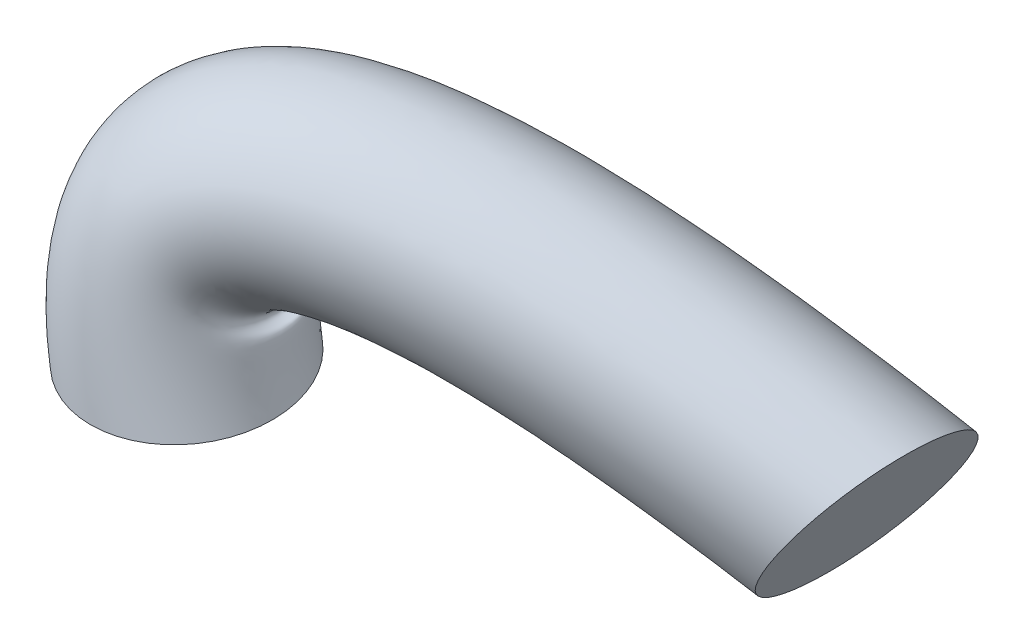
ISO-10303-21;
HEADER;
FILE_DESCRIPTION(('STEP AP214'),'2;1');
FILE_NAME('part.step','',(''),(''),'','','');
FILE_SCHEMA(('AUTOMOTIVE_DESIGN { 1 0 10303 214 1 1 1 1 }'));
ENDSEC;
DATA;
#1=APPLICATION_CONTEXT('core data for automotive mechanical design processes');
#2=APPLICATION_PROTOCOL_DEFINITION('international standard','automotive_design',2000,#1);
#3=PRODUCT_CONTEXT('',#1,'mechanical');
#4=PRODUCT('Part','Part','',(#3));
#5=PRODUCT_RELATED_PRODUCT_CATEGORY('part','',(#4));
#6=PRODUCT_DEFINITION_FORMATION('','',#4);
#7=PRODUCT_DEFINITION_CONTEXT('part definition',#1,'design');
#8=PRODUCT_DEFINITION('design','',#6,#7);
#9=PRODUCT_DEFINITION_SHAPE('','',#8);
#10=(LENGTH_UNIT() NAMED_UNIT(*) SI_UNIT(.MILLI.,.METRE.));
#11=(NAMED_UNIT(*) PLANE_ANGLE_UNIT() SI_UNIT($,.RADIAN.));
#12=(NAMED_UNIT(*) SI_UNIT($,.STERADIAN.) SOLID_ANGLE_UNIT());
#13=UNCERTAINTY_MEASURE_WITH_UNIT(LENGTH_MEASURE(1.E-05),#10,'distance_accuracy_value','');
#14=(GEOMETRIC_REPRESENTATION_CONTEXT(3) GLOBAL_UNCERTAINTY_ASSIGNED_CONTEXT((#13)) GLOBAL_UNIT_ASSIGNED_CONTEXT((#10,
#11,#12)) REPRESENTATION_CONTEXT('',''));
#15=CARTESIAN_POINT('',(0.,0.,0.));
#16=DIRECTION('',(0.,0.,1.));
#17=DIRECTION('',(1.,0.,0.));
#18=AXIS2_PLACEMENT_3D('',#15,#16,#17);
#19=CARTESIAN_POINT('',(-180.892438936026,511.560903975284,397.69758628671));
#20=DIRECTION('',(0.,0.994032679339711,0.109082686090487));
#21=DIRECTION('',(0.,-0.109082686090487,0.994032679339711));
#22=AXIS2_PLACEMENT_3D('',#19,#20,#21);
#23=PLANE('',#22);
#24=CARTESIAN_POINT('',(-180.892438936026,511.560903975284,397.69758628671));
#25=DIRECTION('',(0.,0.994032679339711,0.109082686090487));
#26=DIRECTION('',(0.,-0.109082686090487,0.994032679339711));
#27=AXIS2_PLACEMENT_3D('',#24,#25,#26);
#28=CIRCLE('',#27,31.75);
#29=CARTESIAN_POINT('',(-180.892438936026,508.097528691911,429.258123855746));
#30=VERTEX_POINT('',#29);
#31=EDGE_CURVE('E40',#30,#30,#28,.T.);
#32=ORIENTED_EDGE('',*,*,#31,.F.);
#33=EDGE_LOOP('',(#32));
#34=FACE_BOUND('',#33,.T.);
#35=ADVANCED_FACE('F33',(#34),#23,.F.);
#36=CARTESIAN_POINT('',(-15.6074389360235,520.715978156015,339.752092259279));
#37=DIRECTION('',(0.849490226044737,-0.526704787908429,0.030796464875044));
#38=DIRECTION('',(0.289320304010376,0.513848886861982,0.807621868920132));
#39=AXIS2_PLACEMENT_3D('',#36,#37,#38);
#40=PLANE('',#39);
#41=CARTESIAN_POINT('',(-15.6074389360235,520.715978156015,339.752092259279));
#42=DIRECTION('',(0.849490226044737,-0.526704787908429,0.030796464875044));
#43=DIRECTION('',(0.289320304010376,0.513848886861982,0.807621868920132));
#44=AXIS2_PLACEMENT_3D('',#41,#42,#43);
#45=CIRCLE('',#44,31.75);
#46=CARTESIAN_POINT('',(-6.42151928369401,537.030680313883,365.394086597493));
#47=VERTEX_POINT('',#46);
#48=EDGE_CURVE('E11',#47,#47,#45,.T.);
#49=ORIENTED_EDGE('',*,*,#48,.T.);
#50=EDGE_LOOP('',(#49));
#51=FACE_BOUND('',#50,.T.);
#52=ADVANCED_FACE('F47',(#51),#40,.T.);
#53=CARTESIAN_POINT('',(-180.892438936026,508.097528691911,429.258123855746));
#54=CARTESIAN_POINT('',(-182.166530935944,512.763292099232,429.041596092701));
#55=CARTESIAN_POINT('',(-183.181430108507,517.23065368848,428.763991868873));
#56=CARTESIAN_POINT('',(-184.676031600783,525.829435660423,428.072345054372));
#57=CARTESIAN_POINT('',(-185.156939325926,529.961789704067,427.658584971981));
#58=CARTESIAN_POINT('',(-185.52422522625,537.962122632186,426.664264877963));
#59=CARTESIAN_POINT('',(-185.411077125502,541.833714748399,426.083361333465));
#60=CARTESIAN_POINT('',(-184.692808191902,547.458201620203,425.049561805907));
#61=CARTESIAN_POINT('',(-184.361215002877,549.301724380378,424.677747458662));
#62=CARTESIAN_POINT('',(-183.492405255422,552.911956820982,423.874381890556));
#63=CARTESIAN_POINT('',(-182.954921255074,554.678647298004,423.442741673443));
#64=CARTESIAN_POINT('',(-181.657344007078,558.106998533524,422.517852200586));
#65=CARTESIAN_POINT('',(-180.897021501054,559.768388858214,422.024562216608));
#66=CARTESIAN_POINT('',(-179.149539806747,562.947751487526,420.980299209503));
#67=CARTESIAN_POINT('',(-178.162386160262,564.465310078295,420.429386015574));
#68=CARTESIAN_POINT('',(-175.973810717107,567.319374532261,419.279455117145));
#69=CARTESIAN_POINT('',(-174.772649867759,568.655597105736,418.680566539042));
#70=CARTESIAN_POINT('',(-172.181243563343,571.121630466475,417.446869243752));
#71=CARTESIAN_POINT('',(-170.791314607246,572.25144000795,416.812169204693));
#72=CARTESIAN_POINT('',(-166.38029761375,575.3185282815,414.870504962867));
#73=CARTESIAN_POINT('',(-163.122604062256,576.930485507444,413.527979491072));
#74=CARTESIAN_POINT('',(-156.125232331602,579.357233567494,410.789314927413));
#75=CARTESIAN_POINT('',(-152.384020383585,580.176360248063,409.392042902347));
#76=CARTESIAN_POINT('',(-144.457831114374,581.131512974813,406.541015805077));
#77=CARTESIAN_POINT('',(-140.270946929787,581.268155495122,405.08652069409));
#78=CARTESIAN_POINT('',(-131.439950440454,580.933131740607,402.105959467203));
#79=CARTESIAN_POINT('',(-126.795070229812,580.461067703296,400.579685791926));
#80=CARTESIAN_POINT('',(-112.140588580384,578.194465816304,395.873163722725));
#81=CARTESIAN_POINT('',(-101.408165352943,575.553477183969,392.563638062911));
#82=CARTESIAN_POINT('',(-77.8810873292259,568.15107327617,385.534514941067));
#83=CARTESIAN_POINT('',(-65.0872522470407,563.385751360492,381.815745516398));
#84=CARTESIAN_POINT('',(-37.3644330667755,551.769992217711,373.938192645559));
#85=CARTESIAN_POINT('',(-22.4362434616655,544.91847691152,369.779832521705));
#86=CARTESIAN_POINT('',(-6.42151928369405,537.030680313883,365.394086597493));
#87=CARTESIAN_POINT('',(-117.392438936026,508.097528691911,429.258123855746));
#88=CARTESIAN_POINT('',(-118.666530935605,510.747880505907,429.323800998297));
#89=CARTESIAN_POINT('',(-119.772844199085,512.921716841242,429.398683008627));
#90=CARTESIAN_POINT('',(-121.870287675978,516.209418530627,429.657380384884));
#91=CARTESIAN_POINT('',(-122.86058625273,517.317111373417,429.841774944371));
#92=CARTESIAN_POINT('',(-125.099023783852,518.469316391636,430.447828018599));
#93=CARTESIAN_POINT('',(-126.356009105984,518.502921633189,430.874046502742));
#94=CARTESIAN_POINT('',(-128.773817116014,518.033680653603,431.768632457556));
#95=CARTESIAN_POINT('',(-129.668296932746,517.795117726042,432.108685493603));
#96=CARTESIAN_POINT('',(-131.655482393757,517.256709138338,432.865329041681));
#97=CARTESIAN_POINT('',(-132.74890363908,516.95774194579,433.282041872626));
#98=CARTESIAN_POINT('',(-135.103135098466,516.424849505366,434.163744995053));
#99=CARTESIAN_POINT('',(-136.363841088177,516.192340816627,434.628501204224));
#100=CARTESIAN_POINT('',(-138.956335959648,515.905749668898,435.557398645073));
#101=CARTESIAN_POINT('',(-140.286939844399,515.852730890982,436.02098469131));
#102=CARTESIAN_POINT('',(-142.876704611879,515.984515961391,436.890363702302));
#103=CARTESIAN_POINT('',(-144.134313821797,516.169251738131,437.29563424926));
#104=CARTESIAN_POINT('',(-146.433937224602,516.764801385557,438.0006080845));
#105=CARTESIAN_POINT('',(-147.475036814783,517.174638278694,438.30013462581));
#106=CARTESIAN_POINT('',(-150.116947702308,518.645196948698,438.999930836222));
#107=CARTESIAN_POINT('',(-151.214634642401,519.940432171238,439.194880307774));
#108=CARTESIAN_POINT('',(-151.83834602881,522.511101793793,439.048749121964));
#109=CARTESIAN_POINT('',(-151.38103758874,523.779958829393,438.714303325544));
#110=CARTESIAN_POINT('',(-149.107059253427,525.881499887637,437.64046524579));
#111=CARTESIAN_POINT('',(-147.2976204948,526.718479120068,436.902950535051));
#112=CARTESIAN_POINT('',(-142.569477844356,527.802562733303,435.13023536555));
#113=CARTESIAN_POINT('',(-139.651860487303,528.053084578739,434.094928871975));
#114=CARTESIAN_POINT('',(-129.508327282774,527.863018461846,430.644101848404));
#115=CARTESIAN_POINT('',(-120.911497888677,526.479687546551,427.890606183088));
#116=CARTESIAN_POINT('',(-100.836331477529,521.258914336572,421.739399723491));
#117=CARTESIAN_POINT('',(-89.3445956673569,517.429139587939,418.336021871617));
#118=CARTESIAN_POINT('',(-63.7892989370727,507.449059884744,410.97251296314));
#119=CARTESIAN_POINT('',(-49.7204045790935,501.299110831228,407.010503640609));
#120=CARTESIAN_POINT('',(-34.4379119665137,494.031220884504,402.788982369821));
#121=CARTESIAN_POINT('',(-117.392438936026,515.024279258657,366.137048717674));
#122=CARTESIAN_POINT('',(-118.166163526916,516.98782378236,366.127357327203));
#123=CARTESIAN_POINT('',(-118.732076810706,518.355202836138,366.129900508726));
#124=CARTESIAN_POINT('',(-119.702277586303,519.668965107487,366.278550515764));
#125=CARTESIAN_POINT('',(-120.103322629858,519.607308495331,366.424671521504));
#126=CARTESIAN_POINT('',(-121.23547574646,517.91665765877,367.049530904678));
#127=CARTESIAN_POINT('',(-121.974482738143,516.269530036968,367.533516317988));
#128=CARTESIAN_POINT('',(-123.874789481726,512.870311920743,368.660956257453));
#129=CARTESIAN_POINT('',(-124.641504742364,511.588588933803,369.103275492729));
#130=CARTESIAN_POINT('',(-126.505198717871,508.85925957159,370.124363576292));
#131=CARTESIAN_POINT('',(-127.603427917601,507.41257007009,370.703432735934));
#132=CARTESIAN_POINT('',(-130.13328466829,504.53606563425,371.973504983052));
#133=CARTESIAN_POINT('',(-131.565266511326,503.108208125106,372.664355444312));
#134=CARTESIAN_POINT('',(-134.674777342654,500.459528563584,374.101245858072));
#135=CARTESIAN_POINT('',(-136.351110249649,499.240597618066,374.846610966334));
#136=CARTESIAN_POINT('',(-139.781660249538,497.144436992133,376.316195511839));
#137=CARTESIAN_POINT('',(-141.533803775514,496.267705820887,377.039634279252));
#138=CARTESIAN_POINT('',(-144.921455909005,494.894918327504,378.393223222363));
#139=CARTESIAN_POINT('',(-146.555416916378,494.397887520307,379.022979295445));
#140=CARTESIAN_POINT('',(-151.039558637316,493.405183568474,380.699249935904));
#141=CARTESIAN_POINT('',(-153.441012353373,493.407326656822,381.522224427224));
#142=CARTESIAN_POINT('',(-156.519390099192,493.953237533367,382.501124081821));
#143=CARTESIAN_POINT('',(-157.216048779767,494.48175626333,382.665949971107));
#144=CARTESIAN_POINT('',(-157.02069898198,495.435914716379,382.465374917298));
#145=CARTESIAN_POINT('',(-156.139735368131,495.864616700938,382.103331623347));
#146=CARTESIAN_POINT('',(-153.066162799614,496.315856146374,380.986454857233));
#147=CARTESIAN_POINT('',(-150.876176189804,496.342606595903,380.231930469431));
#148=CARTESIAN_POINT('',(-142.679962592432,495.632684950625,377.52148218265));
#149=CARTESIAN_POINT('',(-135.073210960073,494.096810571009,375.128768024168));
#150=CARTESIAN_POINT('',(-116.63531741444,488.680174669541,369.566282418958));
#151=CARTESIAN_POINT('',(-105.789137281173,484.814893974652,366.389187836954));
#152=CARTESIAN_POINT('',(-81.3279041397077,474.802403945372,359.405287754694));
#153=CARTESIAN_POINT('',(-67.7059287106637,468.657706681082,355.595757334602));
#154=CARTESIAN_POINT('',(-52.8097512711726,461.401816568768,351.504993693393));
#155=CARTESIAN_POINT('',(-180.892438936026,515.024279258657,366.137048717674));
#156=CARTESIAN_POINT('',(-181.666163527348,519.003235375685,365.845152421853));
#157=CARTESIAN_POINT('',(-182.140662720141,522.664139683376,365.495209368972));
#158=CARTESIAN_POINT('',(-182.508021511095,529.288982237283,364.693515185251));
#159=CARTESIAN_POINT('',(-182.39967570302,532.251986825889,364.241481549114));
#160=CARTESIAN_POINT('',(-181.660677188893,537.409463899412,363.265967764042));
#161=CARTESIAN_POINT('',(-181.029550757661,539.600323152098,362.74283114871));
#162=CARTESIAN_POINT('',(-179.793780557615,542.294832887384,361.941885605804));
#163=CARTESIAN_POINT('',(-179.334422812495,543.095195588139,361.672337457807));
#164=CARTESIAN_POINT('',(-178.342121579537,544.514507254234,361.133416425148));
#165=CARTESIAN_POINT('',(-177.809445533596,545.133475422341,360.864132536751));
#166=CARTESIAN_POINT('',(-176.687493576902,546.218214662371,360.327612188585));
#167=CARTESIAN_POINT('',(-176.098446924229,546.684256166656,360.060416456696));
#168=CARTESIAN_POINT('',(-174.867981189726,547.501530382248,359.524146422501));
#169=CARTESIAN_POINT('',(-174.22655656553,547.853176805379,359.25501229058));
#170=CARTESIAN_POINT('',(-172.878766354748,548.479295563003,358.705286926701));
#171=CARTESIAN_POINT('',(-172.172139821476,548.754051188529,358.424566569034));
#172=CARTESIAN_POINT('',(-170.668762247746,549.251747408384,357.839484381616));
#173=CARTESIAN_POINT('',(-169.871694708802,549.474689249524,357.535013874347));
#174=CARTESIAN_POINT('',(-167.302908548836,550.078514901355,356.56982406251));
#175=CARTESIAN_POINT('',(-165.348981773141,550.39737999294,355.855323610479));
#176=CARTESIAN_POINT('',(-160.806276402072,550.799369307155,354.241689887314));
#177=CARTESIAN_POINT('',(-158.219031574511,550.87815768205,353.34368954791));
#178=CARTESIAN_POINT('',(-152.371470843028,550.685927803505,351.365925476585));
#179=CARTESIAN_POINT('',(-149.113061803001,550.414293075991,350.286901782385));
#180=CARTESIAN_POINT('',(-141.936635395828,549.446425153678,347.962178958885));
#181=CARTESIAN_POINT('',(-138.019385932314,548.750589720528,346.716687389381));
#182=CARTESIAN_POINT('',(-125.312223890041,545.964132304948,342.750544056971));
#183=CARTESIAN_POINT('',(-115.56987842434,543.170600208599,339.801799903991));
#184=CARTESIAN_POINT('',(-93.6800732661375,535.572333608966,333.361397636534));
#185=CARTESIAN_POINT('',(-81.5317938604327,530.771505746781,329.868911481311));
#186=CARTESIAN_POINT('',(-54.9030382698343,519.123336278764,322.370967437538));
#187=CARTESIAN_POINT('',(-40.4217675912155,512.277072760617,318.365086215951));
#188=CARTESIAN_POINT('',(-24.793358588353,504.401275998147,314.110097921065));
#189=CARTESIAN_POINT('',(-244.392438936026,515.024279258657,366.137048717674));
#190=CARTESIAN_POINT('',(-245.16616352778,521.018646969009,365.562947516504));
#191=CARTESIAN_POINT('',(-245.549248629575,526.973076530613,364.860518229219));
#192=CARTESIAN_POINT('',(-245.313765435886,538.908999367079,363.108479854738));
#193=CARTESIAN_POINT('',(-244.696028776182,544.896665156446,362.058291576723));
#194=CARTESIAN_POINT('',(-242.085878631326,556.902270140055,359.482404623405));
#195=CARTESIAN_POINT('',(-240.084618777179,562.931116267227,357.952145979432));
#196=CARTESIAN_POINT('',(-235.712771633503,571.719353854025,355.222814954155));
#197=CARTESIAN_POINT('',(-234.027340882627,574.601802242474,354.241399422885));
#198=CARTESIAN_POINT('',(-230.179044441203,580.169754936878,352.142469274004));
#199=CARTESIAN_POINT('',(-228.015463149591,582.854380774593,351.024832337567));
#200=CARTESIAN_POINT('',(-223.241702485514,587.900363690493,348.681719394119));
#201=CARTESIAN_POINT('',(-220.631627337133,590.260304208206,347.45647746908));
#202=CARTESIAN_POINT('',(-215.061185036797,594.543532200912,344.947046986931));
#203=CARTESIAN_POINT('',(-212.102002881412,596.465755992692,343.663413614827));
#204=CARTESIAN_POINT('',(-205.975872459957,599.814154133873,341.094378341562));
#205=CARTESIAN_POINT('',(-202.810475867438,601.240396556171,339.809498858816));
#206=CARTESIAN_POINT('',(-196.416068586487,603.608576489264,337.285745540868));
#207=CARTESIAN_POINT('',(-193.187972501226,604.551490978741,336.04704845325));
#208=CARTESIAN_POINT('',(-183.566258460355,606.751846234235,332.440398189117));
#209=CARTESIAN_POINT('',(-177.256951192908,607.387433329058,330.188422793733));
#210=CARTESIAN_POINT('',(-165.093162704951,607.645501080943,325.982255692806));
#211=CARTESIAN_POINT('',(-159.222014369254,607.274559100771,324.021429124713));
#212=CARTESIAN_POINT('',(-147.722242704077,605.935940890631,320.266476035872));
#213=CARTESIAN_POINT('',(-142.086388237871,604.963969451044,318.470471941423));
#214=CARTESIAN_POINT('',(-130.807107992043,602.576994160982,314.937903060537));
#215=CARTESIAN_POINT('',(-125.162595674824,601.158572845153,313.201444309332));
#216=CARTESIAN_POINT('',(-107.944485187651,596.295579659272,307.979605931293));
#217=CARTESIAN_POINT('',(-96.0665458886062,592.244389846189,304.474831783814));
#218=CARTESIAN_POINT('',(-70.7248291178347,582.464492548392,297.156512854111));
#219=CARTESIAN_POINT('',(-57.2744504396927,576.728117518911,293.348635125668));
#220=CARTESIAN_POINT('',(-28.478172399961,563.444268612155,285.336647120381));
#221=CARTESIAN_POINT('',(-13.1376064717673,555.896438840152,281.134415097299));
#222=CARTESIAN_POINT('',(3.22303409446667,547.400735427526,276.715202148737));
#223=CARTESIAN_POINT('',(-244.392438936026,508.097528691911,429.258123855746));
#224=CARTESIAN_POINT('',(-245.666530936284,514.778703692557,428.759391187104));
#225=CARTESIAN_POINT('',(-246.590016017928,521.539590535717,428.12930072912));
#226=CARTESIAN_POINT('',(-247.481775525588,535.449452790218,426.487309723859));
#227=CARTESIAN_POINT('',(-247.453292399123,542.606468034716,425.47539499959));
#228=CARTESIAN_POINT('',(-245.949426668648,557.454928872736,422.880701737326));
#229=CARTESIAN_POINT('',(-244.466145145021,565.16450786361,421.292676164187));
#230=CARTESIAN_POINT('',(-240.611799267791,576.882722586804,418.330491154258));
#231=CARTESIAN_POINT('',(-239.054133073008,580.808331034714,417.24680942372));
#232=CARTESIAN_POINT('',(-235.329328117088,588.567204503627,414.883434739432));
#233=CARTESIAN_POINT('',(-233.160938871069,592.399552650219,413.603441474259));
#234=CARTESIAN_POINT('',(-228.21155291569,599.789147561683,410.871959406119));
#235=CARTESIAN_POINT('',(-225.43020191393,603.3444368998,409.420623228992));
#236=CARTESIAN_POINT('',(-219.342743653846,609.989753306154,406.403199773932));
#237=CARTESIAN_POINT('',(-216.037832476125,613.077889265608,404.83778733984));
#238=CARTESIAN_POINT('',(-209.070916822335,618.654233103131,401.668546531989));
#239=CARTESIAN_POINT('',(-205.410985913721,621.141942473341,400.065498828824));
#240=CARTESIAN_POINT('',(-197.928549902084,625.478459547393,396.893130403004));
#241=CARTESIAN_POINT('',(-194.107592399709,627.328241737206,395.324203783576));
#242=CARTESIAN_POINT('',(-182.643647525191,631.991859614303,390.741079089512));
#243=CARTESIAN_POINT('',(-175.030573482111,633.92053884365,387.861078674371));
#244=CARTESIAN_POINT('',(-160.412118634394,636.203365341194,382.529880732862));
#245=CARTESIAN_POINT('',(-153.38700317843,636.572761666733,380.069782479149));
#246=CARTESIAN_POINT('',(-139.808602975321,636.38152606199,375.441566364364));
#247=CARTESIAN_POINT('',(-133.244273364774,635.817831870175,373.270090853128));
#248=CARTESIAN_POINT('',(-120.310423036551,634.063700747911,369.081683568855));
#249=CARTESIAN_POINT('',(-113.938279972322,632.869050827853,367.064442711876));
#250=CARTESIAN_POINT('',(-94.7728498779931,628.525913170762,361.102225597046));
#251=CARTESIAN_POINT('',(-81.9048328172093,624.627266821387,357.236669942734));
#252=CARTESIAN_POINT('',(-54.9258431809231,615.043232215769,349.329630158644));
#253=CARTESIAN_POINT('',(-40.8299088267245,609.342363133046,345.295469161179));
#254=CARTESIAN_POINT('',(-10.9395671964783,596.090924550678,336.903872327979));
#255=CARTESIAN_POINT('',(4.84791765576246,588.537842991813,332.549161402801));
#256=CARTESIAN_POINT('',(21.5948733991256,580.030139743262,327.999190825166));
#257=CARTESIAN_POINT('',(-180.892438936026,508.097528691911,429.258123855746));
#258=CARTESIAN_POINT('',(-182.166530935944,512.763292099232,429.041596092701));
#259=CARTESIAN_POINT('',(-183.181430108507,517.23065368848,428.763991868873));
#260=CARTESIAN_POINT('',(-184.676031600783,525.829435660423,428.072345054372));
#261=CARTESIAN_POINT('',(-185.156939325926,529.961789704067,427.658584971981));
#262=CARTESIAN_POINT('',(-185.52422522625,537.962122632186,426.664264877963));
#263=CARTESIAN_POINT('',(-185.411077125502,541.833714748399,426.083361333465));
#264=CARTESIAN_POINT('',(-184.692808191902,547.458201620203,425.049561805907));
#265=CARTESIAN_POINT('',(-184.361215002877,549.301724380378,424.677747458662));
#266=CARTESIAN_POINT('',(-183.492405255422,552.911956820982,423.874381890556));
#267=CARTESIAN_POINT('',(-182.954921255074,554.678647298004,423.442741673443));
#268=CARTESIAN_POINT('',(-181.657344007078,558.106998533524,422.517852200586));
#269=CARTESIAN_POINT('',(-180.897021501054,559.768388858214,422.024562216608));
#270=CARTESIAN_POINT('',(-179.149539806747,562.947751487526,420.980299209503));
#271=CARTESIAN_POINT('',(-178.162386160262,564.465310078295,420.429386015574));
#272=CARTESIAN_POINT('',(-175.973810717107,567.319374532261,419.279455117145));
#273=CARTESIAN_POINT('',(-174.772649867759,568.655597105736,418.680566539042));
#274=CARTESIAN_POINT('',(-172.181243563343,571.121630466475,417.446869243752));
#275=CARTESIAN_POINT('',(-170.791314607246,572.25144000795,416.812169204693));
#276=CARTESIAN_POINT('',(-166.38029761375,575.3185282815,414.870504962867));
#277=CARTESIAN_POINT('',(-163.122604062256,576.930485507444,413.527979491072));
#278=CARTESIAN_POINT('',(-156.125232331602,579.357233567494,410.789314927413));
#279=CARTESIAN_POINT('',(-152.384020383585,580.176360248063,409.392042902347));
#280=CARTESIAN_POINT('',(-144.457831114374,581.131512974813,406.541015805077));
#281=CARTESIAN_POINT('',(-140.270946929787,581.268155495122,405.08652069409));
#282=CARTESIAN_POINT('',(-131.439950440454,580.933131740607,402.105959467203));
#283=CARTESIAN_POINT('',(-126.795070229812,580.461067703296,400.579685791926));
#284=CARTESIAN_POINT('',(-112.140588580384,578.194465816304,395.873163722725));
#285=CARTESIAN_POINT('',(-101.408165352943,575.553477183969,392.563638062911));
#286=CARTESIAN_POINT('',(-77.8810873292259,568.15107327617,385.534514941067));
#287=CARTESIAN_POINT('',(-65.0872522470407,563.385751360492,381.815745516398));
#288=CARTESIAN_POINT('',(-37.3644330667755,551.769992217711,373.938192645559));
#289=CARTESIAN_POINT('',(-22.4362434616655,544.91847691152,369.779832521705));
#290=CARTESIAN_POINT('',(-6.42151928369405,537.030680313883,365.394086597493));
#291=(BOUNDED_SURFACE() B_SPLINE_SURFACE(3,3,((#53,#54,#55,#56,#57,#58,#59,#60,#61,#62,#63,#64,
#65,#66,#67,#68,#69,#70,#71,#72,#73,#74,#75,#76,#77,#78,#79,#80,#81,#82,#83,#84,#85,#86),(#87,
#88,#89,#90,#91,#92,#93,#94,#95,#96,#97,#98,#99,#100,#101,#102,#103,#104,#105,#106,#107,#108,
#109,#110,#111,#112,#113,#114,#115,#116,#117,#118,#119,#120),(#121,#122,#123,#124,#125,#126,
#127,#128,#129,#130,#131,#132,#133,#134,#135,#136,#137,#138,#139,#140,#141,#142,#143,#144,#145,
#146,#147,#148,#149,#150,#151,#152,#153,#154),(#155,#156,#157,#158,#159,#160,#161,#162,#163,
#164,#165,#166,#167,#168,#169,#170,#171,#172,#173,#174,#175,#176,#177,#178,#179,#180,#181,#182,
#183,#184,#185,#186,#187,#188),(#189,#190,#191,#192,#193,#194,#195,#196,#197,#198,#199,#200,
#201,#202,#203,#204,#205,#206,#207,#208,#209,#210,#211,#212,#213,#214,#215,#216,#217,#218,#219,
#220,#221,#222),(#223,#224,#225,#226,#227,#228,#229,#230,#231,#232,#233,#234,#235,#236,#237,
#238,#239,#240,#241,#242,#243,#244,#245,#246,#247,#248,#249,#250,#251,#252,#253,#254,#255,#256),
(#257,#258,#259,#260,#261,#262,#263,#264,#265,#266,#267,#268,#269,#270,#271,#272,#273,#274,#275,
#276,#277,#278,#279,#280,#281,#282,#283,#284,#285,#286,#287,#288,#289,#290)),.UNSPECIFIED.,.T.,
.F.,.F.) B_SPLINE_SURFACE_WITH_KNOTS((4,3,4),(4,2,2,2,2,2,2,2,2,2,2,2,2,2,2,2,4),(0.,0.5,1.),
(0.,0.0625,0.125,0.1875,0.21875,0.25,0.28125,0.3125,0.34375,0.375,0.4375,0.5,0.5625,0.625,0.75,
0.875,1.),.UNSPECIFIED.) GEOMETRIC_REPRESENTATION_ITEM() RATIONAL_B_SPLINE_SURFACE(((1.,1.,1.,
1.,1.,1.,1.,1.,1.,1.,1.,1.,1.,1.,1.,1.,1.,1.,1.,1.,1.,1.,1.,1.,1.,1.,1.,1.,1.,1.,1.,1.,1.,1.),
(0.333333333333333,0.333333333333333,0.333333333333333,0.333333333333333,0.333333333333333,
0.333333333333333,0.333333333333333,0.333333333333333,0.333333333333333,0.333333333333333,
0.333333333333333,0.333333333333333,0.333333333333333,0.333333333333333,0.333333333333333,
0.333333333333333,0.333333333333333,0.333333333333333,0.333333333333333,0.333333333333333,
0.333333333333333,0.333333333333333,0.333333333333333,0.333333333333333,0.333333333333333,
0.333333333333333,0.333333333333333,0.333333333333333,0.333333333333333,0.333333333333333,
0.333333333333333,0.333333333333333,0.333333333333333,0.333333333333333),(0.333333333333333,
0.333333333333333,0.333333333333333,0.333333333333333,0.333333333333333,0.333333333333333,
0.333333333333333,0.333333333333333,0.333333333333333,0.333333333333333,0.333333333333333,
0.333333333333333,0.333333333333333,0.333333333333333,0.333333333333333,0.333333333333333,
0.333333333333333,0.333333333333333,0.333333333333333,0.333333333333333,0.333333333333333,
0.333333333333333,0.333333333333333,0.333333333333333,0.333333333333333,0.333333333333333,
0.333333333333333,0.333333333333333,0.333333333333333,0.333333333333333,0.333333333333333,
0.333333333333333,0.333333333333333,0.333333333333333),(1.,1.,1.,1.,1.,1.,1.,1.,1.,1.,1.,1.,1.,
1.,1.,1.,1.,1.,1.,1.,1.,1.,1.,1.,1.,1.,1.,1.,1.,1.,1.,1.,1.,1.),(0.333333333333333,
0.333333333333333,0.333333333333333,0.333333333333333,0.333333333333333,0.333333333333333,
0.333333333333333,0.333333333333333,0.333333333333333,0.333333333333333,0.333333333333333,
0.333333333333333,0.333333333333333,0.333333333333333,0.333333333333333,0.333333333333333,
0.333333333333333,0.333333333333333,0.333333333333333,0.333333333333333,0.333333333333333,
0.333333333333333,0.333333333333333,0.333333333333333,0.333333333333333,0.333333333333333,
0.333333333333333,0.333333333333333,0.333333333333333,0.333333333333333,0.333333333333333,
0.333333333333333,0.333333333333333,0.333333333333333),(0.333333333333333,0.333333333333333,
0.333333333333333,0.333333333333333,0.333333333333333,0.333333333333333,0.333333333333333,
0.333333333333333,0.333333333333333,0.333333333333333,0.333333333333333,0.333333333333333,
0.333333333333333,0.333333333333333,0.333333333333333,0.333333333333333,0.333333333333333,
0.333333333333333,0.333333333333333,0.333333333333333,0.333333333333333,0.333333333333333,
0.333333333333333,0.333333333333333,0.333333333333333,0.333333333333333,0.333333333333333,
0.333333333333333,0.333333333333333,0.333333333333333,0.333333333333333,0.333333333333333,
0.333333333333333,0.333333333333333),(1.,1.,1.,1.,1.,1.,1.,1.,1.,1.,1.,1.,1.,1.,1.,1.,1.,1.,1.,
1.,1.,1.,1.,1.,1.,1.,1.,1.,1.,1.,1.,1.,1.,1.))) REPRESENTATION_ITEM('') SURFACE());
#292=ORIENTED_EDGE('',*,*,#48,.F.);
#293=EDGE_LOOP('',(#292));
#294=FACE_BOUND('',#293,.T.);
#295=ORIENTED_EDGE('',*,*,#31,.T.);
#296=EDGE_LOOP('',(#295));
#297=FACE_BOUND('',#296,.T.);
#298=ADVANCED_FACE('F49',(#294,#297),#291,.T.);
#299=CLOSED_SHELL('',(#35,#52,#298));
#300=MANIFOLD_SOLID_BREP('B2',#299);
#301=ADVANCED_BREP_SHAPE_REPRESENTATION('',(#18,#300),#14);
#302=SHAPE_DEFINITION_REPRESENTATION(#9,#301);
ENDSEC;
END-ISO-10303-21;
